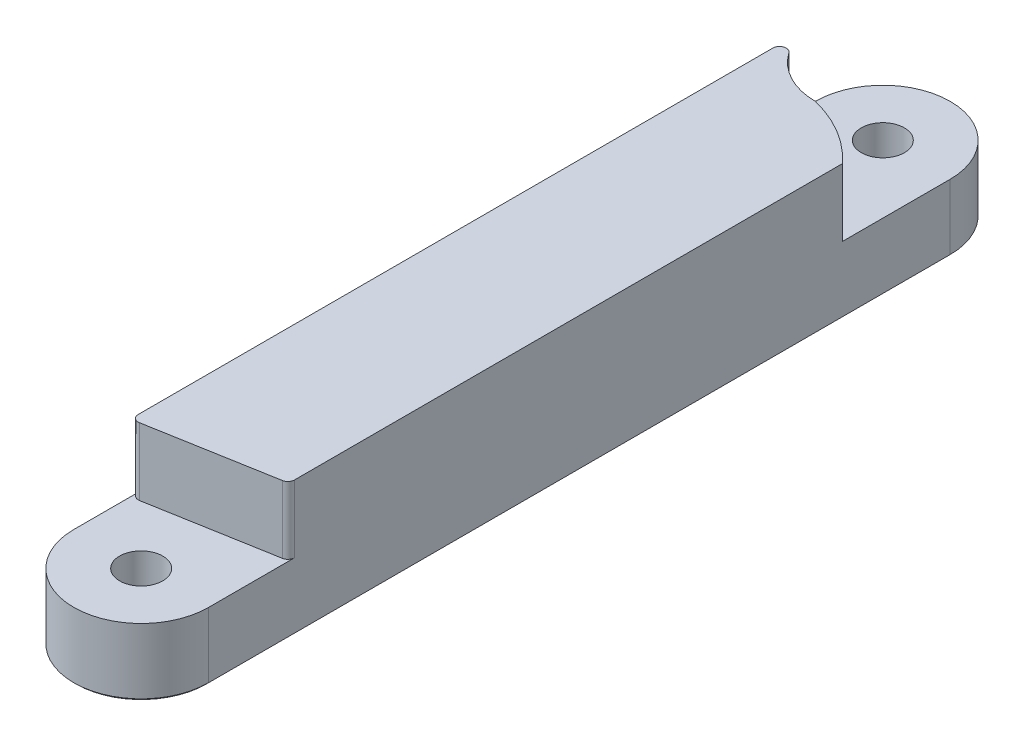
ISO-10303-21;
HEADER;
FILE_DESCRIPTION(('STEP AP214'),'2;1');
FILE_NAME('part.step','',(''),(''),'','','');
FILE_SCHEMA(('AUTOMOTIVE_DESIGN { 1 0 10303 214 1 1 1 1 }'));
ENDSEC;
DATA;
#1=APPLICATION_CONTEXT('core data for automotive mechanical design processes');
#2=APPLICATION_PROTOCOL_DEFINITION('international standard','automotive_design',2000,#1);
#3=PRODUCT_CONTEXT('',#1,'mechanical');
#4=PRODUCT('Part','Part','',(#3));
#5=PRODUCT_RELATED_PRODUCT_CATEGORY('part','',(#4));
#6=PRODUCT_DEFINITION_FORMATION('','',#4);
#7=PRODUCT_DEFINITION_CONTEXT('part definition',#1,'design');
#8=PRODUCT_DEFINITION('design','',#6,#7);
#9=PRODUCT_DEFINITION_SHAPE('','',#8);
#10=(LENGTH_UNIT() NAMED_UNIT(*) SI_UNIT(.MILLI.,.METRE.));
#11=(NAMED_UNIT(*) PLANE_ANGLE_UNIT() SI_UNIT($,.RADIAN.));
#12=(NAMED_UNIT(*) SI_UNIT($,.STERADIAN.) SOLID_ANGLE_UNIT());
#13=UNCERTAINTY_MEASURE_WITH_UNIT(LENGTH_MEASURE(1.E-05),#10,'distance_accuracy_value','');
#14=(GEOMETRIC_REPRESENTATION_CONTEXT(3) GLOBAL_UNCERTAINTY_ASSIGNED_CONTEXT((#13)) GLOBAL_UNIT_ASSIGNED_CONTEXT((#10,
#11,#12)) REPRESENTATION_CONTEXT('',''));
#15=CARTESIAN_POINT('',(0.,0.,0.));
#16=DIRECTION('',(0.,0.,1.));
#17=DIRECTION('',(1.,0.,0.));
#18=AXIS2_PLACEMENT_3D('',#15,#16,#17);
#19=CARTESIAN_POINT('',(-5.,10.,0.));
#20=DIRECTION('',(-1.,0.,0.));
#21=DIRECTION('',(0.,0.,1.));
#22=AXIS2_PLACEMENT_3D('',#19,#20,#21);
#23=PLANE('',#22);
#24=DIRECTION('',(0.,0.,-1.));
#25=VECTOR('',#24,1.);
#26=CARTESIAN_POINT('',(-5.,10.,0.));
#27=LINE('',#26,#25);
#28=CARTESIAN_POINT('',(-5.,10.,-4.79137495218349));
#29=VERTEX_POINT('',#28);
#30=CARTESIAN_POINT('',(-5.,10.,-51.8377223398316));
#31=VERTEX_POINT('',#30);
#32=EDGE_CURVE('E284',#29,#31,#27,.T.);
#33=ORIENTED_EDGE('',*,*,#32,.T.);
#34=DIRECTION('',(0.,1.,0.));
#35=VECTOR('',#34,1.);
#36=CARTESIAN_POINT('',(-5.,5.,-51.8377223398316));
#37=LINE('',#36,#35);
#38=CARTESIAN_POINT('',(-5.,5.,-51.8377223398316));
#39=VERTEX_POINT('',#38);
#40=EDGE_CURVE('E274',#31,#39,#37,.F.);
#41=ORIENTED_EDGE('',*,*,#40,.T.);
#42=DIRECTION('',(0.,0.,-1.));
#43=VECTOR('',#42,1.);
#44=CARTESIAN_POINT('',(-5.,5.,0.));
#45=LINE('',#44,#43);
#46=CARTESIAN_POINT('',(-5.,5.,-55.));
#47=VERTEX_POINT('',#46);
#48=EDGE_CURVE('E256',#39,#47,#45,.T.);
#49=ORIENTED_EDGE('',*,*,#48,.T.);
#50=DIRECTION('',(0.,-1.,0.));
#51=VECTOR('',#50,1.);
#52=CARTESIAN_POINT('',(-5.,5.,-55.));
#53=LINE('',#52,#51);
#54=CARTESIAN_POINT('',(-5.,0.16,-55.));
#55=VERTEX_POINT('',#54);
#56=EDGE_CURVE('E298',#47,#55,#53,.T.);
#57=ORIENTED_EDGE('',*,*,#56,.T.);
#58=DIRECTION('',(0.,0.,1.));
#59=VECTOR('',#58,1.);
#60=CARTESIAN_POINT('',(-5.,0.16,0.));
#61=LINE('',#60,#59);
#62=CARTESIAN_POINT('',(-5.,0.16,0.));
#63=VERTEX_POINT('',#62);
#64=EDGE_CURVE('E253',#55,#63,#61,.T.);
#65=ORIENTED_EDGE('',*,*,#64,.T.);
#66=DIRECTION('',(0.,-1.,0.));
#67=VECTOR('',#66,1.);
#68=CARTESIAN_POINT('',(-5.,5.,0.));
#69=LINE('',#68,#67);
#70=CARTESIAN_POINT('',(-5.,5.,0.));
#71=VERTEX_POINT('',#70);
#72=EDGE_CURVE('E291',#71,#63,#69,.T.);
#73=ORIENTED_EDGE('',*,*,#72,.F.);
#74=DIRECTION('',(0.,0.,-1.));
#75=VECTOR('',#74,1.);
#76=CARTESIAN_POINT('',(-5.,5.,0.));
#77=LINE('',#76,#75);
#78=CARTESIAN_POINT('',(-5.,5.,-4.79137495218349));
#79=VERTEX_POINT('',#78);
#80=EDGE_CURVE('E350',#71,#79,#77,.T.);
#81=ORIENTED_EDGE('',*,*,#80,.T.);
#82=DIRECTION('',(0.,-1.,0.));
#83=VECTOR('',#82,1.);
#84=CARTESIAN_POINT('',(-5.,10.,-4.79137495218349));
#85=LINE('',#84,#83);
#86=EDGE_CURVE('E204',#79,#29,#85,.F.);
#87=ORIENTED_EDGE('',*,*,#86,.T.);
#88=EDGE_LOOP('',(#33,#41,#49,#57,#65,#73,#81,#87));
#89=FACE_BOUND('',#88,.T.);
#90=ADVANCED_FACE('F53',(#89),#23,.T.);
#91=CARTESIAN_POINT('',(-0.868240888334674,10.,-4.92403876506104));
#92=DIRECTION('',(0.173648177666935,0.,0.984807753012207));
#93=DIRECTION('',(0.984807753012207,0.,-0.173648177666935));
#94=AXIS2_PLACEMENT_3D('',#91,#92,#93);
#95=PLANE('',#94);
#96=DIRECTION('',(-0.984807753012207,0.,0.173648177666935));
#97=VECTOR('',#96,1.);
#98=CARTESIAN_POINT('',(-0.868240888334674,5.,-4.92403876506104));
#99=LINE('',#98,#97);
#100=CARTESIAN_POINT('',(4.58682408883347,5.,-5.88591390205361));
#101=VERTEX_POINT('',#100);
#102=CARTESIAN_POINT('',(-4.41317591116653,5.,-4.29897107567739));
#103=VERTEX_POINT('',#102);
#104=EDGE_CURVE('E329',#101,#103,#99,.T.);
#105=ORIENTED_EDGE('',*,*,#104,.F.);
#106=DIRECTION('',(0.,-1.,0.));
#107=VECTOR('',#106,1.);
#108=CARTESIAN_POINT('',(4.58682408883347,10.,-5.88591390205361));
#109=LINE('',#108,#107);
#110=CARTESIAN_POINT('',(4.58682408883347,10.,-5.88591390205361));
#111=VERTEX_POINT('',#110);
#112=EDGE_CURVE('E197',#101,#111,#109,.F.);
#113=ORIENTED_EDGE('',*,*,#112,.T.);
#114=DIRECTION('',(-0.984807753012207,0.,0.173648177666935));
#115=VECTOR('',#114,1.);
#116=CARTESIAN_POINT('',(-0.868240888334674,10.,-4.92403876506104));
#117=LINE('',#116,#115);
#118=CARTESIAN_POINT('',(-4.41317591116653,10.,-4.29897107567739));
#119=VERTEX_POINT('',#118);
#120=EDGE_CURVE('E168',#111,#119,#117,.T.);
#121=ORIENTED_EDGE('',*,*,#120,.T.);
#122=DIRECTION('',(0.,-1.,0.));
#123=VECTOR('',#122,1.);
#124=CARTESIAN_POINT('',(-4.41317591116653,10.,-4.29897107567739));
#125=LINE('',#124,#123);
#126=EDGE_CURVE('E190',#119,#103,#125,.T.);
#127=ORIENTED_EDGE('',*,*,#126,.T.);
#128=EDGE_LOOP('',(#105,#113,#121,#127));
#129=FACE_BOUND('',#128,.T.);
#130=ADVANCED_FACE('F343',(#129),#95,.T.);
#131=CARTESIAN_POINT('',(5.,10.,0.));
#132=DIRECTION('',(-1.,0.,0.));
#133=DIRECTION('',(0.,0.,1.));
#134=AXIS2_PLACEMENT_3D('',#131,#132,#133);
#135=PLANE('',#134);
#136=DIRECTION('',(0.,-1.,0.));
#137=VECTOR('',#136,1.);
#138=CARTESIAN_POINT('',(5.,5.,0.));
#139=LINE('',#138,#137);
#140=CARTESIAN_POINT('',(5.,5.,0.));
#141=VERTEX_POINT('',#140);
#142=CARTESIAN_POINT('',(5.,0.16,0.));
#143=VERTEX_POINT('',#142);
#144=EDGE_CURVE('E324',#141,#143,#139,.T.);
#145=ORIENTED_EDGE('',*,*,#144,.T.);
#146=DIRECTION('',(0.,0.,-1.));
#147=VECTOR('',#146,1.);
#148=CARTESIAN_POINT('',(5.,0.16,0.));
#149=LINE('',#148,#147);
#150=CARTESIAN_POINT('',(5.,0.16,-55.));
#151=VERTEX_POINT('',#150);
#152=EDGE_CURVE('E247',#143,#151,#149,.T.);
#153=ORIENTED_EDGE('',*,*,#152,.T.);
#154=DIRECTION('',(0.,-1.,0.));
#155=VECTOR('',#154,1.);
#156=CARTESIAN_POINT('',(5.,5.,-55.));
#157=LINE('',#156,#155);
#158=CARTESIAN_POINT('',(5.,5.,-55.));
#159=VERTEX_POINT('',#158);
#160=EDGE_CURVE('E303',#159,#151,#157,.T.);
#161=ORIENTED_EDGE('',*,*,#160,.F.);
#162=DIRECTION('',(0.,0.,-1.));
#163=VECTOR('',#162,1.);
#164=CARTESIAN_POINT('',(5.,5.,0.));
#165=LINE('',#164,#163);
#166=CARTESIAN_POINT('',(5.,5.,-47.));
#167=VERTEX_POINT('',#166);
#168=EDGE_CURVE('E183',#167,#159,#165,.T.);
#169=ORIENTED_EDGE('',*,*,#168,.F.);
#170=DIRECTION('',(0.,-1.,0.));
#171=VECTOR('',#170,1.);
#172=CARTESIAN_POINT('',(5.,10.,-47.));
#173=LINE('',#172,#171);
#174=CARTESIAN_POINT('',(5.,10.,-47.));
#175=VERTEX_POINT('',#174);
#176=EDGE_CURVE('E167',#175,#167,#173,.T.);
#177=ORIENTED_EDGE('',*,*,#176,.F.);
#178=DIRECTION('',(0.,0.,-1.));
#179=VECTOR('',#178,1.);
#180=CARTESIAN_POINT('',(5.,10.,0.));
#181=LINE('',#180,#179);
#182=CARTESIAN_POINT('',(5.,10.,-6.37831777855972));
#183=VERTEX_POINT('',#182);
#184=EDGE_CURVE('E154',#183,#175,#181,.T.);
#185=ORIENTED_EDGE('',*,*,#184,.F.);
#186=DIRECTION('',(0.,-1.,0.));
#187=VECTOR('',#186,1.);
#188=CARTESIAN_POINT('',(5.,5.,-6.37831777855972));
#189=LINE('',#188,#187);
#190=CARTESIAN_POINT('',(5.,5.,-6.37831777855972));
#191=VERTEX_POINT('',#190);
#192=EDGE_CURVE('E185',#183,#191,#189,.T.);
#193=ORIENTED_EDGE('',*,*,#192,.T.);
#194=DIRECTION('',(0.,0.,-1.));
#195=VECTOR('',#194,1.);
#196=CARTESIAN_POINT('',(5.,5.,0.));
#197=LINE('',#196,#195);
#198=EDGE_CURVE('E326',#141,#191,#197,.T.);
#199=ORIENTED_EDGE('',*,*,#198,.F.);
#200=EDGE_LOOP('',(#145,#153,#161,#169,#177,#185,#193,#199));
#201=FACE_BOUND('',#200,.T.);
#202=ADVANCED_FACE('F180',(#201),#135,.F.);
#203=CARTESIAN_POINT('',(0.,10.,0.));
#204=DIRECTION('',(0.,1.,0.));
#205=DIRECTION('',(0.,0.,1.));
#206=AXIS2_PLACEMENT_3D('',#203,#204,#205);
#207=PLANE('',#206);
#208=CARTESIAN_POINT('',(0.,10.,-55.));
#209=DIRECTION('',(0.,-1.,0.));
#210=DIRECTION('',(0.,0.,1.));
#211=AXIS2_PLACEMENT_3D('',#208,#209,#210);
#212=CIRCLE('',#211,5.00000000000001);
#213=CARTESIAN_POINT('',(0.,10.,-50.));
#214=VERTEX_POINT('',#213);
#215=CARTESIAN_POINT('',(-4.09090909090909,10.,-52.1252021271197));
#216=VERTEX_POINT('',#215);
#217=EDGE_CURVE('E176',#214,#216,#212,.T.);
#218=ORIENTED_EDGE('',*,*,#217,.T.);
#219=CARTESIAN_POINT('',(-4.5,10.,-51.8377223398316));
#220=DIRECTION('',(0.,1.,0.));
#221=DIRECTION('',(0.,0.,1.));
#222=AXIS2_PLACEMENT_3D('',#219,#220,#221);
#223=CIRCLE('',#222,0.5);
#224=EDGE_CURVE('E62',#216,#31,#223,.T.);
#225=ORIENTED_EDGE('',*,*,#224,.T.);
#226=ORIENTED_EDGE('',*,*,#32,.F.);
#227=CARTESIAN_POINT('',(-4.5,10.,-4.79137495218349));
#228=DIRECTION('',(0.,1.,0.));
#229=DIRECTION('',(0.,0.,1.));
#230=AXIS2_PLACEMENT_3D('',#227,#228,#229);
#231=CIRCLE('',#230,0.5);
#232=EDGE_CURVE('E200',#29,#119,#231,.T.);
#233=ORIENTED_EDGE('',*,*,#232,.T.);
#234=ORIENTED_EDGE('',*,*,#120,.F.);
#235=CARTESIAN_POINT('',(4.5,10.,-6.37831777855972));
#236=DIRECTION('',(0.,1.,0.));
#237=DIRECTION('',(0.,0.,1.));
#238=AXIS2_PLACEMENT_3D('',#235,#236,#237);
#239=CIRCLE('',#238,0.5);
#240=EDGE_CURVE('E161',#111,#183,#239,.T.);
#241=ORIENTED_EDGE('',*,*,#240,.T.);
#242=ORIENTED_EDGE('',*,*,#184,.T.);
#243=CARTESIAN_POINT('',(-2.42144168260624,10.,-40.2975971956563));
#244=DIRECTION('',(0.,1.,0.));
#245=DIRECTION('',(0.,0.,-1.));
#246=AXIS2_PLACEMENT_3D('',#243,#244,#245);
#247=CIRCLE('',#246,10.);
#248=EDGE_CURVE('E157',#175,#214,#247,.T.);
#249=ORIENTED_EDGE('',*,*,#248,.T.);
#250=EDGE_LOOP('',(#218,#225,#226,#233,#234,#241,#242,#249));
#251=FACE_BOUND('',#250,.T.);
#252=ADVANCED_FACE('F156',(#251),#207,.T.);
#253=CARTESIAN_POINT('',(0.,0.,0.));
#254=DIRECTION('',(0.,1.,0.));
#255=DIRECTION('',(0.,0.,1.));
#256=AXIS2_PLACEMENT_3D('',#253,#254,#255);
#257=PLANE('',#256);
#258=CARTESIAN_POINT('',(0.,0.,-55.));
#259=DIRECTION('',(0.,1.,0.));
#260=DIRECTION('',(0.,0.,1.));
#261=AXIS2_PLACEMENT_3D('',#258,#259,#260);
#262=CIRCLE('',#261,1.76);
#263=CARTESIAN_POINT('',(0.,0.,-53.24));
#264=VERTEX_POINT('',#263);
#265=EDGE_CURVE('E231',#264,#264,#262,.T.);
#266=ORIENTED_EDGE('',*,*,#265,.T.);
#267=EDGE_LOOP('',(#266));
#268=FACE_BOUND('',#267,.T.);
#269=CARTESIAN_POINT('',(0.,0.,0.));
#270=DIRECTION('',(0.,1.,0.));
#271=DIRECTION('',(0.,0.,1.));
#272=AXIS2_PLACEMENT_3D('',#269,#270,#271);
#273=CIRCLE('',#272,1.76);
#274=CARTESIAN_POINT('',(0.,0.,1.76));
#275=VERTEX_POINT('',#274);
#276=EDGE_CURVE('E227',#275,#275,#273,.T.);
#277=ORIENTED_EDGE('',*,*,#276,.T.);
#278=EDGE_LOOP('',(#277));
#279=FACE_BOUND('',#278,.T.);
#280=DIRECTION('',(0.,0.,1.));
#281=VECTOR('',#280,1.);
#282=CARTESIAN_POINT('',(4.84,0.,0.));
#283=LINE('',#282,#281);
#284=CARTESIAN_POINT('',(4.84,0.,-55.));
#285=VERTEX_POINT('',#284);
#286=CARTESIAN_POINT('',(4.84,0.,0.));
#287=VERTEX_POINT('',#286);
#288=EDGE_CURVE('E220',#285,#287,#283,.T.);
#289=ORIENTED_EDGE('',*,*,#288,.T.);
#290=CARTESIAN_POINT('',(0.,0.,0.));
#291=DIRECTION('',(0.,1.,0.));
#292=DIRECTION('',(0.,0.,1.));
#293=AXIS2_PLACEMENT_3D('',#290,#291,#292);
#294=CIRCLE('',#293,4.84);
#295=CARTESIAN_POINT('',(-4.84,0.,0.));
#296=VERTEX_POINT('',#295);
#297=EDGE_CURVE('E223',#287,#296,#294,.F.);
#298=ORIENTED_EDGE('',*,*,#297,.T.);
#299=DIRECTION('',(0.,0.,-1.));
#300=VECTOR('',#299,1.);
#301=CARTESIAN_POINT('',(-4.84,0.,-55.));
#302=LINE('',#301,#300);
#303=CARTESIAN_POINT('',(-4.84,0.,-55.));
#304=VERTEX_POINT('',#303);
#305=EDGE_CURVE('E214',#296,#304,#302,.T.);
#306=ORIENTED_EDGE('',*,*,#305,.T.);
#307=CARTESIAN_POINT('',(0.,0.,-55.));
#308=DIRECTION('',(0.,1.,0.));
#309=DIRECTION('',(0.,0.,1.));
#310=AXIS2_PLACEMENT_3D('',#307,#308,#309);
#311=CIRCLE('',#310,4.84);
#312=EDGE_CURVE('E217',#304,#285,#311,.F.);
#313=ORIENTED_EDGE('',*,*,#312,.T.);
#314=EDGE_LOOP('',(#289,#298,#306,#313));
#315=FACE_BOUND('',#314,.T.);
#316=ADVANCED_FACE('F371',(#268,#279,#315),#257,.F.);
#317=CARTESIAN_POINT('',(0.,5.,0.));
#318=DIRECTION('',(0.,-1.,0.));
#319=DIRECTION('',(0.,0.,-1.));
#320=AXIS2_PLACEMENT_3D('',#317,#318,#319);
#321=CYLINDRICAL_SURFACE('',#320,5.);
#322=ORIENTED_EDGE('',*,*,#72,.T.);
#323=CARTESIAN_POINT('',(0.,0.16,0.));
#324=DIRECTION('',(0.,1.,0.));
#325=DIRECTION('',(0.,0.,1.));
#326=AXIS2_PLACEMENT_3D('',#323,#324,#325);
#327=CIRCLE('',#326,5.);
#328=EDGE_CURVE('E243',#63,#143,#327,.T.);
#329=ORIENTED_EDGE('',*,*,#328,.T.);
#330=ORIENTED_EDGE('',*,*,#144,.F.);
#331=CARTESIAN_POINT('',(0.,5.,0.));
#332=DIRECTION('',(0.,1.,0.));
#333=DIRECTION('',(0.,0.,1.));
#334=AXIS2_PLACEMENT_3D('',#331,#332,#333);
#335=CIRCLE('',#334,5.);
#336=EDGE_CURVE('E422',#71,#141,#335,.T.);
#337=ORIENTED_EDGE('',*,*,#336,.F.);
#338=EDGE_LOOP('',(#322,#329,#330,#337));
#339=FACE_BOUND('',#338,.T.);
#340=ADVANCED_FACE('F322',(#339),#321,.T.);
#341=CARTESIAN_POINT('',(0.,5.,0.));
#342=DIRECTION('',(0.,-1.,0.));
#343=DIRECTION('',(0.,0.,-1.));
#344=AXIS2_PLACEMENT_3D('',#341,#342,#343);
#345=CYLINDRICAL_SURFACE('',#344,1.6);
#346=CARTESIAN_POINT('',(0.,0.160000000000004,0.));
#347=DIRECTION('',(0.,1.,0.));
#348=DIRECTION('',(0.,0.,1.));
#349=AXIS2_PLACEMENT_3D('',#346,#347,#348);
#350=CIRCLE('',#349,1.6);
#351=CARTESIAN_POINT('',(0.,0.160000000000004,1.6));
#352=VERTEX_POINT('',#351);
#353=EDGE_CURVE('E239',#352,#352,#350,.F.);
#354=ORIENTED_EDGE('',*,*,#353,.T.);
#355=EDGE_LOOP('',(#354));
#356=FACE_BOUND('',#355,.T.);
#357=CARTESIAN_POINT('',(0.,5.,0.));
#358=DIRECTION('',(0.,1.,0.));
#359=DIRECTION('',(0.,0.,1.));
#360=AXIS2_PLACEMENT_3D('',#357,#358,#359);
#361=CIRCLE('',#360,1.6);
#362=CARTESIAN_POINT('',(0.,5.,1.6));
#363=VERTEX_POINT('',#362);
#364=EDGE_CURVE('E417',#363,#363,#361,.T.);
#365=ORIENTED_EDGE('',*,*,#364,.T.);
#366=EDGE_LOOP('',(#365));
#367=FACE_BOUND('',#366,.T.);
#368=ADVANCED_FACE('F377',(#356,#367),#345,.F.);
#369=CARTESIAN_POINT('',(0.,5.,0.));
#370=DIRECTION('',(0.,1.,0.));
#371=DIRECTION('',(0.,0.,1.));
#372=AXIS2_PLACEMENT_3D('',#369,#370,#371);
#373=PLANE('',#372);
#374=ORIENTED_EDGE('',*,*,#364,.F.);
#375=EDGE_LOOP('',(#374));
#376=FACE_BOUND('',#375,.T.);
#377=ORIENTED_EDGE('',*,*,#80,.F.);
#378=ORIENTED_EDGE('',*,*,#336,.T.);
#379=ORIENTED_EDGE('',*,*,#198,.T.);
#380=CARTESIAN_POINT('',(4.5,5.,-6.37831777855972));
#381=DIRECTION('',(0.,1.,0.));
#382=DIRECTION('',(0.,0.,1.));
#383=AXIS2_PLACEMENT_3D('',#380,#381,#382);
#384=CIRCLE('',#383,0.5);
#385=EDGE_CURVE('E207',#191,#101,#384,.F.);
#386=ORIENTED_EDGE('',*,*,#385,.T.);
#387=ORIENTED_EDGE('',*,*,#104,.T.);
#388=CARTESIAN_POINT('',(-4.5,5.,-4.79137495218349));
#389=DIRECTION('',(0.,1.,0.));
#390=DIRECTION('',(0.,0.,1.));
#391=AXIS2_PLACEMENT_3D('',#388,#389,#390);
#392=CIRCLE('',#391,0.5);
#393=EDGE_CURVE('E210',#103,#79,#392,.F.);
#394=ORIENTED_EDGE('',*,*,#393,.T.);
#395=EDGE_LOOP('',(#377,#378,#379,#386,#387,#394));
#396=FACE_BOUND('',#395,.T.);
#397=ADVANCED_FACE('F349',(#376,#396),#373,.T.);
#398=CARTESIAN_POINT('',(0.,5.,-55.));
#399=DIRECTION('',(0.,-1.,0.));
#400=DIRECTION('',(0.,0.,-1.));
#401=AXIS2_PLACEMENT_3D('',#398,#399,#400);
#402=CYLINDRICAL_SURFACE('',#401,5.);
#403=ORIENTED_EDGE('',*,*,#160,.T.);
#404=CARTESIAN_POINT('',(0.,0.16,-55.));
#405=DIRECTION('',(0.,1.,0.));
#406=DIRECTION('',(0.,0.,1.));
#407=AXIS2_PLACEMENT_3D('',#404,#405,#406);
#408=CIRCLE('',#407,5.);
#409=EDGE_CURVE('E250',#151,#55,#408,.T.);
#410=ORIENTED_EDGE('',*,*,#409,.T.);
#411=ORIENTED_EDGE('',*,*,#56,.F.);
#412=CARTESIAN_POINT('',(0.,5.,-55.));
#413=DIRECTION('',(0.,1.,0.));
#414=DIRECTION('',(0.,0.,1.));
#415=AXIS2_PLACEMENT_3D('',#412,#413,#414);
#416=CIRCLE('',#415,5.);
#417=EDGE_CURVE('E295',#159,#47,#416,.T.);
#418=ORIENTED_EDGE('',*,*,#417,.F.);
#419=EDGE_LOOP('',(#403,#410,#411,#418));
#420=FACE_BOUND('',#419,.T.);
#421=ADVANCED_FACE('F385',(#420),#402,.T.);
#422=CARTESIAN_POINT('',(0.,5.,-55.));
#423=DIRECTION('',(0.,-1.,0.));
#424=DIRECTION('',(0.,0.,-1.));
#425=AXIS2_PLACEMENT_3D('',#422,#423,#424);
#426=CYLINDRICAL_SURFACE('',#425,1.6);
#427=CARTESIAN_POINT('',(0.,0.16000000000001,-55.));
#428=DIRECTION('',(0.,1.,0.));
#429=DIRECTION('',(0.,0.,1.));
#430=AXIS2_PLACEMENT_3D('',#427,#428,#429);
#431=CIRCLE('',#430,1.6);
#432=CARTESIAN_POINT('',(0.,0.16000000000001,-53.4));
#433=VERTEX_POINT('',#432);
#434=EDGE_CURVE('E235',#433,#433,#431,.F.);
#435=ORIENTED_EDGE('',*,*,#434,.T.);
#436=EDGE_LOOP('',(#435));
#437=FACE_BOUND('',#436,.T.);
#438=CARTESIAN_POINT('',(0.,5.,-55.));
#439=DIRECTION('',(0.,1.,0.));
#440=DIRECTION('',(0.,0.,1.));
#441=AXIS2_PLACEMENT_3D('',#438,#439,#440);
#442=CIRCLE('',#441,1.6);
#443=CARTESIAN_POINT('',(0.,5.,-53.4));
#444=VERTEX_POINT('',#443);
#445=EDGE_CURVE('E408',#444,#444,#442,.T.);
#446=ORIENTED_EDGE('',*,*,#445,.T.);
#447=EDGE_LOOP('',(#446));
#448=FACE_BOUND('',#447,.T.);
#449=ADVANCED_FACE('F387',(#437,#448),#426,.F.);
#450=CARTESIAN_POINT('',(0.,5.,0.));
#451=DIRECTION('',(0.,1.,0.));
#452=DIRECTION('',(0.,0.,1.));
#453=AXIS2_PLACEMENT_3D('',#450,#451,#452);
#454=PLANE('',#453);
#455=ORIENTED_EDGE('',*,*,#445,.F.);
#456=EDGE_LOOP('',(#455));
#457=FACE_BOUND('',#456,.T.);
#458=ORIENTED_EDGE('',*,*,#417,.T.);
#459=ORIENTED_EDGE('',*,*,#48,.F.);
#460=CARTESIAN_POINT('',(-4.5,5.,-51.8377223398316));
#461=DIRECTION('',(0.,1.,0.));
#462=DIRECTION('',(0.,0.,1.));
#463=AXIS2_PLACEMENT_3D('',#460,#461,#462);
#464=CIRCLE('',#463,0.5);
#465=CARTESIAN_POINT('',(-4.09090909090909,5.,-52.1252021271197));
#466=VERTEX_POINT('',#465);
#467=EDGE_CURVE('E11',#39,#466,#464,.F.);
#468=ORIENTED_EDGE('',*,*,#467,.T.);
#469=CARTESIAN_POINT('',(0.,5.,-55.));
#470=DIRECTION('',(0.,-1.,0.));
#471=DIRECTION('',(0.,0.,1.));
#472=AXIS2_PLACEMENT_3D('',#469,#470,#471);
#473=CIRCLE('',#472,5.00000000000001);
#474=CARTESIAN_POINT('',(0.,5.,-50.));
#475=VERTEX_POINT('',#474);
#476=EDGE_CURVE('E271',#475,#466,#473,.T.);
#477=ORIENTED_EDGE('',*,*,#476,.F.);
#478=CARTESIAN_POINT('',(-2.42144168260624,5.,-40.2975971956563));
#479=DIRECTION('',(0.,1.,0.));
#480=DIRECTION('',(0.,0.,-1.));
#481=AXIS2_PLACEMENT_3D('',#478,#479,#480);
#482=CIRCLE('',#481,10.);
#483=EDGE_CURVE('E399',#167,#475,#482,.T.);
#484=ORIENTED_EDGE('',*,*,#483,.F.);
#485=ORIENTED_EDGE('',*,*,#168,.T.);
#486=EDGE_LOOP('',(#458,#459,#468,#477,#484,#485));
#487=FACE_BOUND('',#486,.T.);
#488=ADVANCED_FACE('F294',(#457,#487),#454,.T.);
#489=CARTESIAN_POINT('',(0.,10.,-55.));
#490=DIRECTION('',(0.,-1.,0.));
#491=DIRECTION('',(0.,0.,-1.));
#492=AXIS2_PLACEMENT_3D('',#489,#490,#491);
#493=CYLINDRICAL_SURFACE('',#492,5.00000000000001);
#494=ORIENTED_EDGE('',*,*,#476,.T.);
#495=DIRECTION('',(0.,-1.,0.));
#496=VECTOR('',#495,1.);
#497=CARTESIAN_POINT('',(-4.09090909090909,10.,-52.1252021271197));
#498=LINE('',#497,#496);
#499=EDGE_CURVE('E69',#466,#216,#498,.F.);
#500=ORIENTED_EDGE('',*,*,#499,.T.);
#501=ORIENTED_EDGE('',*,*,#217,.F.);
#502=DIRECTION('',(0.,-1.,0.));
#503=VECTOR('',#502,1.);
#504=CARTESIAN_POINT('',(0.,10.,-50.));
#505=LINE('',#504,#503);
#506=EDGE_CURVE('E174',#214,#475,#505,.T.);
#507=ORIENTED_EDGE('',*,*,#506,.T.);
#508=EDGE_LOOP('',(#494,#500,#501,#507));
#509=FACE_BOUND('',#508,.T.);
#510=ADVANCED_FACE('F361',(#509),#493,.F.);
#511=CARTESIAN_POINT('',(-2.42144168260624,10.,-40.2975971956563));
#512=DIRECTION('',(0.,-1.,0.));
#513=DIRECTION('',(0.,0.,-1.));
#514=AXIS2_PLACEMENT_3D('',#511,#512,#513);
#515=CYLINDRICAL_SURFACE('',#514,10.);
#516=ORIENTED_EDGE('',*,*,#483,.T.);
#517=ORIENTED_EDGE('',*,*,#506,.F.);
#518=ORIENTED_EDGE('',*,*,#248,.F.);
#519=ORIENTED_EDGE('',*,*,#176,.T.);
#520=EDGE_LOOP('',(#516,#517,#518,#519));
#521=FACE_BOUND('',#520,.T.);
#522=ADVANCED_FACE('F171',(#521),#515,.T.);
#523=CARTESIAN_POINT('',(4.5,10.,-6.37831777855972));
#524=DIRECTION('',(0.,1.,0.));
#525=DIRECTION('',(0.,0.,1.));
#526=AXIS2_PLACEMENT_3D('',#523,#524,#525);
#527=CYLINDRICAL_SURFACE('',#526,0.5);
#528=ORIENTED_EDGE('',*,*,#240,.F.);
#529=ORIENTED_EDGE('',*,*,#112,.F.);
#530=ORIENTED_EDGE('',*,*,#385,.F.);
#531=ORIENTED_EDGE('',*,*,#192,.F.);
#532=EDGE_LOOP('',(#528,#529,#530,#531));
#533=FACE_BOUND('',#532,.T.);
#534=ADVANCED_FACE('F353',(#533),#527,.T.);
#535=CARTESIAN_POINT('',(-4.5,10.,-4.79137495218349));
#536=DIRECTION('',(0.,-1.,0.));
#537=DIRECTION('',(0.,0.,-1.));
#538=AXIS2_PLACEMENT_3D('',#535,#536,#537);
#539=CYLINDRICAL_SURFACE('',#538,0.5);
#540=ORIENTED_EDGE('',*,*,#232,.F.);
#541=ORIENTED_EDGE('',*,*,#86,.F.);
#542=ORIENTED_EDGE('',*,*,#393,.F.);
#543=ORIENTED_EDGE('',*,*,#126,.F.);
#544=EDGE_LOOP('',(#540,#541,#542,#543));
#545=FACE_BOUND('',#544,.T.);
#546=ADVANCED_FACE('F346',(#545),#539,.T.);
#547=CARTESIAN_POINT('',(0.,0.,-55.));
#548=DIRECTION('',(0.,-1.,0.));
#549=DIRECTION('',(0.,0.,-1.));
#550=AXIS2_PLACEMENT_3D('',#547,#548,#549);
#551=CONICAL_SURFACE('',#550,1.76,0.78539816339743);
#552=ORIENTED_EDGE('',*,*,#434,.F.);
#553=EDGE_LOOP('',(#552));
#554=FACE_BOUND('',#553,.T.);
#555=ORIENTED_EDGE('',*,*,#265,.F.);
#556=EDGE_LOOP('',(#555));
#557=FACE_BOUND('',#556,.T.);
#558=ADVANCED_FACE('F359',(#554,#557),#551,.F.);
#559=CARTESIAN_POINT('',(0.,0.,0.));
#560=DIRECTION('',(0.,-1.,0.));
#561=DIRECTION('',(0.,0.,-1.));
#562=AXIS2_PLACEMENT_3D('',#559,#560,#561);
#563=CONICAL_SURFACE('',#562,1.76,0.78539816339745);
#564=ORIENTED_EDGE('',*,*,#353,.F.);
#565=EDGE_LOOP('',(#564));
#566=FACE_BOUND('',#565,.T.);
#567=ORIENTED_EDGE('',*,*,#276,.F.);
#568=EDGE_LOOP('',(#567));
#569=FACE_BOUND('',#568,.T.);
#570=ADVANCED_FACE('F506',(#566,#569),#563,.F.);
#571=CARTESIAN_POINT('',(0.,0.16,-55.));
#572=DIRECTION('',(0.,1.,0.));
#573=DIRECTION('',(0.,0.,1.));
#574=AXIS2_PLACEMENT_3D('',#571,#572,#573);
#575=CONICAL_SURFACE('',#574,5.,0.785398163397448);
#576=DIRECTION('',(0.707106781186548,0.707106781186548,0.));
#577=VECTOR('',#576,1.);
#578=CARTESIAN_POINT('',(4.84,0.,-55.));
#579=LINE('',#578,#577);
#580=EDGE_CURVE('E263',#285,#151,#579,.T.);
#581=ORIENTED_EDGE('',*,*,#580,.F.);
#582=ORIENTED_EDGE('',*,*,#312,.F.);
#583=DIRECTION('',(0.707106781186548,-0.707106781186548,0.));
#584=VECTOR('',#583,1.);
#585=CARTESIAN_POINT('',(-5.,0.16,-55.));
#586=LINE('',#585,#584);
#587=EDGE_CURVE('E267',#55,#304,#586,.T.);
#588=ORIENTED_EDGE('',*,*,#587,.F.);
#589=ORIENTED_EDGE('',*,*,#409,.F.);
#590=EDGE_LOOP('',(#581,#582,#588,#589));
#591=FACE_BOUND('',#590,.T.);
#592=ADVANCED_FACE('F309',(#591),#575,.T.);
#593=CARTESIAN_POINT('',(-4.84,0.,0.));
#594=DIRECTION('',(-0.707106781186548,-0.707106781186548,0.));
#595=DIRECTION('',(0.,0.,1.));
#596=AXIS2_PLACEMENT_3D('',#593,#594,#595);
#597=PLANE('',#596);
#598=ORIENTED_EDGE('',*,*,#587,.T.);
#599=ORIENTED_EDGE('',*,*,#305,.F.);
#600=DIRECTION('',(0.707106781186548,-0.707106781186548,0.));
#601=VECTOR('',#600,1.);
#602=CARTESIAN_POINT('',(-5.,0.16,0.));
#603=LINE('',#602,#601);
#604=EDGE_CURVE('E260',#63,#296,#603,.T.);
#605=ORIENTED_EDGE('',*,*,#604,.F.);
#606=ORIENTED_EDGE('',*,*,#64,.F.);
#607=EDGE_LOOP('',(#598,#599,#605,#606));
#608=FACE_BOUND('',#607,.T.);
#609=ADVANCED_FACE('F313',(#608),#597,.T.);
#610=CARTESIAN_POINT('',(5.,0.16,0.));
#611=DIRECTION('',(-0.707106781186548,0.707106781186548,0.));
#612=DIRECTION('',(0.,0.,-1.));
#613=AXIS2_PLACEMENT_3D('',#610,#611,#612);
#614=PLANE('',#613);
#615=ORIENTED_EDGE('',*,*,#580,.T.);
#616=ORIENTED_EDGE('',*,*,#152,.F.);
#617=DIRECTION('',(0.707106781186548,0.707106781186548,0.));
#618=VECTOR('',#617,1.);
#619=CARTESIAN_POINT('',(4.84,0.,0.));
#620=LINE('',#619,#618);
#621=EDGE_CURVE('E257',#287,#143,#620,.T.);
#622=ORIENTED_EDGE('',*,*,#621,.F.);
#623=ORIENTED_EDGE('',*,*,#288,.F.);
#624=EDGE_LOOP('',(#615,#616,#622,#623));
#625=FACE_BOUND('',#624,.T.);
#626=ADVANCED_FACE('F532',(#625),#614,.F.);
#627=CARTESIAN_POINT('',(0.,0.16,0.));
#628=DIRECTION('',(0.,1.,0.));
#629=DIRECTION('',(0.,0.,1.));
#630=AXIS2_PLACEMENT_3D('',#627,#628,#629);
#631=CONICAL_SURFACE('',#630,5.,0.785398163397448);
#632=ORIENTED_EDGE('',*,*,#604,.T.);
#633=ORIENTED_EDGE('',*,*,#297,.F.);
#634=ORIENTED_EDGE('',*,*,#621,.T.);
#635=ORIENTED_EDGE('',*,*,#328,.F.);
#636=EDGE_LOOP('',(#632,#633,#634,#635));
#637=FACE_BOUND('',#636,.T.);
#638=ADVANCED_FACE('F317',(#637),#631,.T.);
#639=CARTESIAN_POINT('',(-4.5,10.,-51.8377223398316));
#640=DIRECTION('',(0.,-1.,0.));
#641=DIRECTION('',(0.,0.,-1.));
#642=AXIS2_PLACEMENT_3D('',#639,#640,#641);
#643=CYLINDRICAL_SURFACE('',#642,0.5);
#644=ORIENTED_EDGE('',*,*,#224,.F.);
#645=ORIENTED_EDGE('',*,*,#499,.F.);
#646=ORIENTED_EDGE('',*,*,#467,.F.);
#647=ORIENTED_EDGE('',*,*,#40,.F.);
#648=EDGE_LOOP('',(#644,#645,#646,#647));
#649=FACE_BOUND('',#648,.T.);
#650=ADVANCED_FACE('F55',(#649),#643,.T.);
#651=CLOSED_SHELL('',(#90,#130,#202,#252,#316,#340,#368,#397,#421,#449,#488,#510,#522,#534,#546,
#558,#570,#592,#609,#626,#638,#650));
#652=MANIFOLD_SOLID_BREP('B2',#651);
#653=ADVANCED_BREP_SHAPE_REPRESENTATION('',(#18,#652),#14);
#654=SHAPE_DEFINITION_REPRESENTATION(#9,#653);
ENDSEC;
END-ISO-10303-21;
